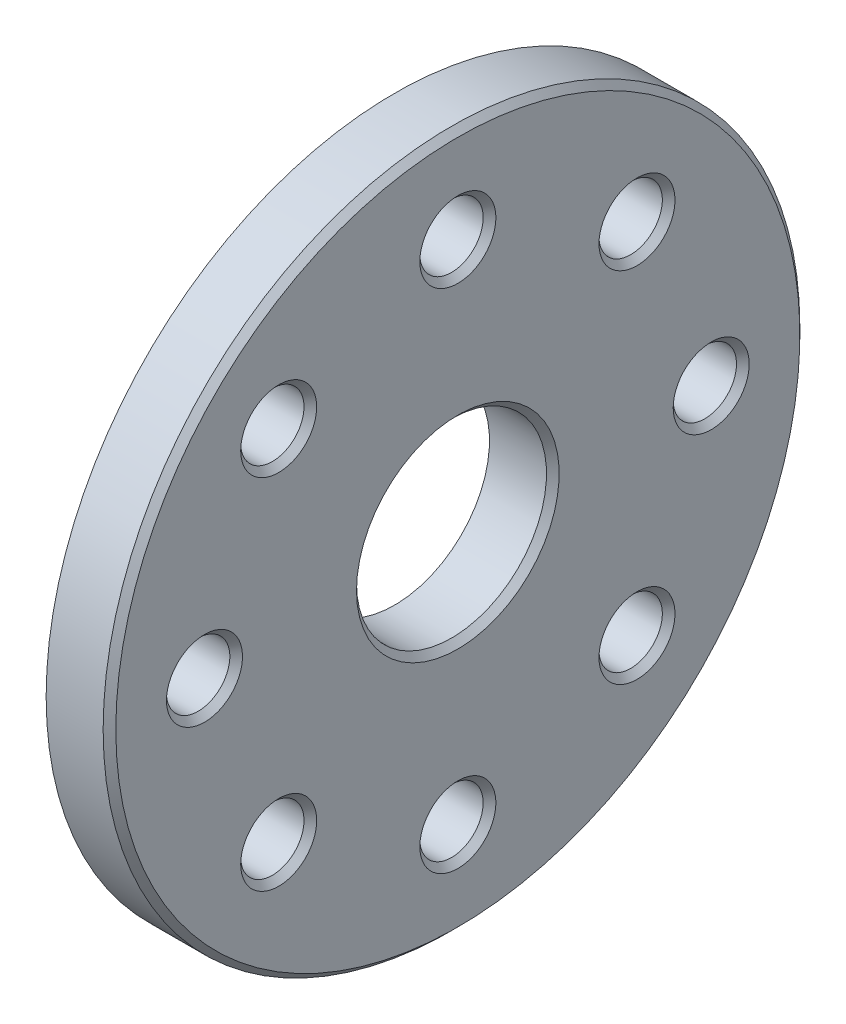
ISO-10303-21;
HEADER;
FILE_DESCRIPTION(('STEP AP214'),'2;1');
FILE_NAME('part.step','',(''),(''),'','','');
FILE_SCHEMA(('AUTOMOTIVE_DESIGN { 1 0 10303 214 1 1 1 1 }'));
ENDSEC;
DATA;
#1=APPLICATION_CONTEXT('core data for automotive mechanical design processes');
#2=APPLICATION_PROTOCOL_DEFINITION('international standard','automotive_design',2000,#1);
#3=PRODUCT_CONTEXT('',#1,'mechanical');
#4=PRODUCT('Part','Part','',(#3));
#5=PRODUCT_RELATED_PRODUCT_CATEGORY('part','',(#4));
#6=PRODUCT_DEFINITION_FORMATION('','',#4);
#7=PRODUCT_DEFINITION_CONTEXT('part definition',#1,'design');
#8=PRODUCT_DEFINITION('design','',#6,#7);
#9=PRODUCT_DEFINITION_SHAPE('','',#8);
#10=(LENGTH_UNIT() NAMED_UNIT(*) SI_UNIT(.MILLI.,.METRE.));
#11=(NAMED_UNIT(*) PLANE_ANGLE_UNIT() SI_UNIT($,.RADIAN.));
#12=(NAMED_UNIT(*) SI_UNIT($,.STERADIAN.) SOLID_ANGLE_UNIT());
#13=UNCERTAINTY_MEASURE_WITH_UNIT(LENGTH_MEASURE(1.E-05),#10,'distance_accuracy_value','');
#14=(GEOMETRIC_REPRESENTATION_CONTEXT(3) GLOBAL_UNCERTAINTY_ASSIGNED_CONTEXT((#13)) GLOBAL_UNIT_ASSIGNED_CONTEXT((#10,
#11,#12)) REPRESENTATION_CONTEXT('',''));
#15=CARTESIAN_POINT('',(0.,0.,0.));
#16=DIRECTION('',(0.,0.,1.));
#17=DIRECTION('',(1.,0.,0.));
#18=AXIS2_PLACEMENT_3D('',#15,#16,#17);
#19=CARTESIAN_POINT('',(0.,0.,0.));
#20=DIRECTION('',(-1.,0.,0.));
#21=DIRECTION('',(0.,0.,1.));
#22=AXIS2_PLACEMENT_3D('',#19,#20,#21);
#23=CYLINDRICAL_SURFACE('',#22,3.);
#24=CARTESIAN_POINT('',(0.799999999999997,0.,0.));
#25=DIRECTION('',(-1.,0.,0.));
#26=DIRECTION('',(0.,0.,1.));
#27=AXIS2_PLACEMENT_3D('',#24,#25,#26);
#28=CIRCLE('',#27,3.);
#29=CARTESIAN_POINT('',(0.799999999999997,0.,3.));
#30=VERTEX_POINT('',#29);
#31=EDGE_CURVE('E65',#30,#30,#28,.F.);
#32=ORIENTED_EDGE('',*,*,#31,.T.);
#33=EDGE_LOOP('',(#32));
#34=FACE_BOUND('',#33,.T.);
#35=CARTESIAN_POINT('',(-1.,0.,0.));
#36=DIRECTION('',(-1.,0.,0.));
#37=DIRECTION('',(0.,0.,1.));
#38=AXIS2_PLACEMENT_3D('',#35,#36,#37);
#39=CIRCLE('',#38,3.);
#40=CARTESIAN_POINT('',(-1.,0.,3.));
#41=VERTEX_POINT('',#40);
#42=EDGE_CURVE('E98',#41,#41,#39,.T.);
#43=ORIENTED_EDGE('',*,*,#42,.T.);
#44=EDGE_LOOP('',(#43));
#45=FACE_BOUND('',#44,.T.);
#46=ADVANCED_FACE('F30',(#34,#45),#23,.F.);
#47=CARTESIAN_POINT('',(-1.,3.,0.));
#48=DIRECTION('',(1.,0.,0.));
#49=DIRECTION('',(0.,0.,-1.));
#50=AXIS2_PLACEMENT_3D('',#47,#48,#49);
#51=PLANE('',#50);
#52=CARTESIAN_POINT('',(-1.,5.65685424949245,5.65685424949231));
#53=DIRECTION('',(-1.,0.,0.));
#54=DIRECTION('',(0.,-0.707106781186539,0.707106781186556));
#55=AXIS2_PLACEMENT_3D('',#52,#53,#54);
#56=CIRCLE('',#55,1.);
#57=CARTESIAN_POINT('',(-1.,4.94974746830591,6.36396103067887));
#58=VERTEX_POINT('',#57);
#59=EDGE_CURVE('E125',#58,#58,#56,.T.);
#60=ORIENTED_EDGE('',*,*,#59,.F.);
#61=EDGE_LOOP('',(#60));
#62=FACE_BOUND('',#61,.T.);
#63=CARTESIAN_POINT('',(-1.,0.,8.));
#64=DIRECTION('',(-1.,0.,0.));
#65=DIRECTION('',(0.,-1.,0.));
#66=AXIS2_PLACEMENT_3D('',#63,#64,#65);
#67=CIRCLE('',#66,1.);
#68=CARTESIAN_POINT('',(-1.,-0.999999999999917,8.00000000000001));
#69=VERTEX_POINT('',#68);
#70=EDGE_CURVE('E122',#69,#69,#67,.T.);
#71=ORIENTED_EDGE('',*,*,#70,.F.);
#72=EDGE_LOOP('',(#71));
#73=FACE_BOUND('',#72,.T.);
#74=CARTESIAN_POINT('',(-1.,-5.65685424949233,5.65685424949243));
#75=DIRECTION('',(-1.,0.,0.));
#76=DIRECTION('',(0.,-0.707106781186554,-0.707106781186541));
#77=AXIS2_PLACEMENT_3D('',#74,#75,#76);
#78=CIRCLE('',#77,1.);
#79=CARTESIAN_POINT('',(-1.,-6.36396103067888,4.94974746830589));
#80=VERTEX_POINT('',#79);
#81=EDGE_CURVE('E119',#80,#80,#78,.T.);
#82=ORIENTED_EDGE('',*,*,#81,.F.);
#83=EDGE_LOOP('',(#82));
#84=FACE_BOUND('',#83,.T.);
#85=CARTESIAN_POINT('',(-1.,-8.,0.));
#86=DIRECTION('',(-1.,0.,0.));
#87=DIRECTION('',(0.,0.,-1.));
#88=AXIS2_PLACEMENT_3D('',#85,#86,#87);
#89=CIRCLE('',#88,1.);
#90=CARTESIAN_POINT('',(-1.,-8.,-1.));
#91=VERTEX_POINT('',#90);
#92=EDGE_CURVE('E116',#91,#91,#89,.T.);
#93=ORIENTED_EDGE('',*,*,#92,.F.);
#94=EDGE_LOOP('',(#93));
#95=FACE_BOUND('',#94,.T.);
#96=CARTESIAN_POINT('',(-1.,-5.65685424949241,-5.65685424949235));
#97=DIRECTION('',(-1.,0.,0.));
#98=DIRECTION('',(0.,0.707106781186544,-0.707106781186551));
#99=AXIS2_PLACEMENT_3D('',#96,#97,#98);
#100=CIRCLE('',#99,1.);
#101=CARTESIAN_POINT('',(-1.,-4.94974746830587,-6.3639610306789));
#102=VERTEX_POINT('',#101);
#103=EDGE_CURVE('E113',#102,#102,#100,.T.);
#104=ORIENTED_EDGE('',*,*,#103,.F.);
#105=EDGE_LOOP('',(#104));
#106=FACE_BOUND('',#105,.T.);
#107=CARTESIAN_POINT('',(-1.,0.,-8.));
#108=DIRECTION('',(-1.,0.,0.));
#109=DIRECTION('',(0.,1.,0.));
#110=AXIS2_PLACEMENT_3D('',#107,#108,#109);
#111=CIRCLE('',#110,1.);
#112=CARTESIAN_POINT('',(-1.,0.999999999999972,-8.));
#113=VERTEX_POINT('',#112);
#114=EDGE_CURVE('E110',#113,#113,#111,.T.);
#115=ORIENTED_EDGE('',*,*,#114,.F.);
#116=EDGE_LOOP('',(#115));
#117=FACE_BOUND('',#116,.T.);
#118=CARTESIAN_POINT('',(-1.,5.65685424949237,-5.65685424949239));
#119=DIRECTION('',(-1.,0.,0.));
#120=DIRECTION('',(0.,0.707106781186549,0.707106781186546));
#121=AXIS2_PLACEMENT_3D('',#118,#119,#120);
#122=CIRCLE('',#121,1.);
#123=CARTESIAN_POINT('',(-1.,6.36396103067892,-4.94974746830584));
#124=VERTEX_POINT('',#123);
#125=EDGE_CURVE('E107',#124,#124,#122,.T.);
#126=ORIENTED_EDGE('',*,*,#125,.F.);
#127=EDGE_LOOP('',(#126));
#128=FACE_BOUND('',#127,.T.);
#129=CARTESIAN_POINT('',(-1.,8.,0.));
#130=DIRECTION('',(-1.,0.,0.));
#131=DIRECTION('',(0.,0.,1.));
#132=AXIS2_PLACEMENT_3D('',#129,#130,#131);
#133=CIRCLE('',#132,1.);
#134=CARTESIAN_POINT('',(-1.,8.,1.));
#135=VERTEX_POINT('',#134);
#136=EDGE_CURVE('E104',#135,#135,#133,.T.);
#137=ORIENTED_EDGE('',*,*,#136,.F.);
#138=EDGE_LOOP('',(#137));
#139=FACE_BOUND('',#138,.T.);
#140=ORIENTED_EDGE('',*,*,#42,.F.);
#141=EDGE_LOOP('',(#140));
#142=FACE_BOUND('',#141,.T.);
#143=CARTESIAN_POINT('',(-1.,0.,0.));
#144=DIRECTION('',(-1.,0.,0.));
#145=DIRECTION('',(0.,0.,1.));
#146=AXIS2_PLACEMENT_3D('',#143,#144,#145);
#147=CIRCLE('',#146,11.);
#148=CARTESIAN_POINT('',(-1.,0.,11.));
#149=VERTEX_POINT('',#148);
#150=EDGE_CURVE('E101',#149,#149,#147,.T.);
#151=ORIENTED_EDGE('',*,*,#150,.T.);
#152=EDGE_LOOP('',(#151));
#153=FACE_BOUND('',#152,.T.);
#154=ADVANCED_FACE('F131',(#62,#73,#84,#95,#106,#117,#128,#139,#142,#153),#51,.F.);
#155=CARTESIAN_POINT('',(0.,0.,0.));
#156=DIRECTION('',(-1.,0.,0.));
#157=DIRECTION('',(0.,0.,1.));
#158=AXIS2_PLACEMENT_3D('',#155,#156,#157);
#159=CYLINDRICAL_SURFACE('',#158,11.);
#160=CARTESIAN_POINT('',(0.799999999999998,0.,0.));
#161=DIRECTION('',(-1.,0.,0.));
#162=DIRECTION('',(0.,0.,1.));
#163=AXIS2_PLACEMENT_3D('',#160,#161,#162);
#164=CIRCLE('',#163,11.);
#165=CARTESIAN_POINT('',(0.799999999999998,0.,11.));
#166=VERTEX_POINT('',#165);
#167=EDGE_CURVE('E62',#166,#166,#164,.T.);
#168=ORIENTED_EDGE('',*,*,#167,.T.);
#169=EDGE_LOOP('',(#168));
#170=FACE_BOUND('',#169,.T.);
#171=ORIENTED_EDGE('',*,*,#150,.F.);
#172=EDGE_LOOP('',(#171));
#173=FACE_BOUND('',#172,.T.);
#174=ADVANCED_FACE('F134',(#170,#173),#159,.T.);
#175=CARTESIAN_POINT('',(1.,11.,0.));
#176=DIRECTION('',(-1.,0.,0.));
#177=DIRECTION('',(0.,0.,1.));
#178=AXIS2_PLACEMENT_3D('',#175,#176,#177);
#179=PLANE('',#178);
#180=CARTESIAN_POINT('',(1.,0.,0.));
#181=DIRECTION('',(-1.,0.,0.));
#182=DIRECTION('',(0.,0.,1.));
#183=AXIS2_PLACEMENT_3D('',#180,#181,#182);
#184=CIRCLE('',#183,3.2);
#185=CARTESIAN_POINT('',(1.,0.,3.2));
#186=VERTEX_POINT('',#185);
#187=EDGE_CURVE('E68',#186,#186,#184,.T.);
#188=ORIENTED_EDGE('',*,*,#187,.T.);
#189=EDGE_LOOP('',(#188));
#190=FACE_BOUND('',#189,.T.);
#191=CARTESIAN_POINT('',(1.,0.,0.));
#192=DIRECTION('',(-1.,0.,0.));
#193=DIRECTION('',(0.,0.,1.));
#194=AXIS2_PLACEMENT_3D('',#191,#192,#193);
#195=CIRCLE('',#194,10.8);
#196=CARTESIAN_POINT('',(1.,0.,10.8));
#197=VERTEX_POINT('',#196);
#198=EDGE_CURVE('E71',#197,#197,#195,.F.);
#199=ORIENTED_EDGE('',*,*,#198,.T.);
#200=EDGE_LOOP('',(#199));
#201=FACE_BOUND('',#200,.T.);
#202=CARTESIAN_POINT('',(1.,8.,0.));
#203=DIRECTION('',(-1.,0.,0.));
#204=DIRECTION('',(0.,0.,1.));
#205=AXIS2_PLACEMENT_3D('',#202,#203,#204);
#206=CIRCLE('',#205,1.2);
#207=CARTESIAN_POINT('',(1.,8.,1.2));
#208=VERTEX_POINT('',#207);
#209=EDGE_CURVE('E74',#208,#208,#206,.T.);
#210=ORIENTED_EDGE('',*,*,#209,.T.);
#211=EDGE_LOOP('',(#210));
#212=FACE_BOUND('',#211,.T.);
#213=CARTESIAN_POINT('',(1.,5.65685424949237,-5.65685424949239));
#214=DIRECTION('',(-1.,0.,0.));
#215=DIRECTION('',(0.,0.,1.));
#216=AXIS2_PLACEMENT_3D('',#213,#214,#215);
#217=CIRCLE('',#216,1.2);
#218=CARTESIAN_POINT('',(1.,5.65685424949237,-4.45685424949239));
#219=VERTEX_POINT('',#218);
#220=EDGE_CURVE('E77',#219,#219,#217,.T.);
#221=ORIENTED_EDGE('',*,*,#220,.T.);
#222=EDGE_LOOP('',(#221));
#223=FACE_BOUND('',#222,.T.);
#224=CARTESIAN_POINT('',(1.,0.,-8.));
#225=DIRECTION('',(-1.,0.,0.));
#226=DIRECTION('',(0.,0.,1.));
#227=AXIS2_PLACEMENT_3D('',#224,#225,#226);
#228=CIRCLE('',#227,1.2);
#229=CARTESIAN_POINT('',(1.,0.,-6.8));
#230=VERTEX_POINT('',#229);
#231=EDGE_CURVE('E80',#230,#230,#228,.T.);
#232=ORIENTED_EDGE('',*,*,#231,.T.);
#233=EDGE_LOOP('',(#232));
#234=FACE_BOUND('',#233,.T.);
#235=CARTESIAN_POINT('',(1.,-5.65685424949241,-5.65685424949235));
#236=DIRECTION('',(-1.,0.,0.));
#237=DIRECTION('',(0.,0.,1.));
#238=AXIS2_PLACEMENT_3D('',#235,#236,#237);
#239=CIRCLE('',#238,1.2);
#240=CARTESIAN_POINT('',(1.,-5.65685424949241,-4.45685424949235));
#241=VERTEX_POINT('',#240);
#242=EDGE_CURVE('E83',#241,#241,#239,.T.);
#243=ORIENTED_EDGE('',*,*,#242,.T.);
#244=EDGE_LOOP('',(#243));
#245=FACE_BOUND('',#244,.T.);
#246=CARTESIAN_POINT('',(1.,-8.,0.));
#247=DIRECTION('',(-1.,0.,0.));
#248=DIRECTION('',(0.,0.,1.));
#249=AXIS2_PLACEMENT_3D('',#246,#247,#248);
#250=CIRCLE('',#249,1.2);
#251=CARTESIAN_POINT('',(1.,-8.,1.2));
#252=VERTEX_POINT('',#251);
#253=EDGE_CURVE('E86',#252,#252,#250,.T.);
#254=ORIENTED_EDGE('',*,*,#253,.T.);
#255=EDGE_LOOP('',(#254));
#256=FACE_BOUND('',#255,.T.);
#257=CARTESIAN_POINT('',(1.,-5.65685424949233,5.65685424949243));
#258=DIRECTION('',(-1.,0.,0.));
#259=DIRECTION('',(0.,0.,1.));
#260=AXIS2_PLACEMENT_3D('',#257,#258,#259);
#261=CIRCLE('',#260,1.2);
#262=CARTESIAN_POINT('',(1.,-5.65685424949233,6.85685424949243));
#263=VERTEX_POINT('',#262);
#264=EDGE_CURVE('E89',#263,#263,#261,.T.);
#265=ORIENTED_EDGE('',*,*,#264,.T.);
#266=EDGE_LOOP('',(#265));
#267=FACE_BOUND('',#266,.T.);
#268=CARTESIAN_POINT('',(1.,0.,8.));
#269=DIRECTION('',(-1.,0.,0.));
#270=DIRECTION('',(0.,0.,1.));
#271=AXIS2_PLACEMENT_3D('',#268,#269,#270);
#272=CIRCLE('',#271,1.2);
#273=CARTESIAN_POINT('',(1.,0.,9.2));
#274=VERTEX_POINT('',#273);
#275=EDGE_CURVE('E92',#274,#274,#272,.T.);
#276=ORIENTED_EDGE('',*,*,#275,.T.);
#277=EDGE_LOOP('',(#276));
#278=FACE_BOUND('',#277,.T.);
#279=CARTESIAN_POINT('',(1.,5.65685424949245,5.65685424949231));
#280=DIRECTION('',(-1.,0.,0.));
#281=DIRECTION('',(0.,0.,1.));
#282=AXIS2_PLACEMENT_3D('',#279,#280,#281);
#283=CIRCLE('',#282,1.2);
#284=CARTESIAN_POINT('',(1.,5.65685424949245,6.85685424949232));
#285=VERTEX_POINT('',#284);
#286=EDGE_CURVE('E95',#285,#285,#283,.T.);
#287=ORIENTED_EDGE('',*,*,#286,.T.);
#288=EDGE_LOOP('',(#287));
#289=FACE_BOUND('',#288,.T.);
#290=ADVANCED_FACE('F155',(#190,#201,#212,#223,#234,#245,#256,#267,#278,#289),#179,.F.);
#291=CARTESIAN_POINT('',(1.,8.,0.));
#292=DIRECTION('',(-1.,0.,0.));
#293=DIRECTION('',(0.,0.,1.));
#294=AXIS2_PLACEMENT_3D('',#291,#292,#293);
#295=CYLINDRICAL_SURFACE('',#294,1.);
#296=CARTESIAN_POINT('',(0.799999999999997,8.,0.));
#297=DIRECTION('',(-1.,0.,0.));
#298=DIRECTION('',(0.,0.,1.));
#299=AXIS2_PLACEMENT_3D('',#296,#297,#298);
#300=CIRCLE('',#299,1.);
#301=CARTESIAN_POINT('',(0.799999999999997,8.,1.));
#302=VERTEX_POINT('',#301);
#303=EDGE_CURVE('E59',#302,#302,#300,.F.);
#304=ORIENTED_EDGE('',*,*,#303,.T.);
#305=EDGE_LOOP('',(#304));
#306=FACE_BOUND('',#305,.T.);
#307=ORIENTED_EDGE('',*,*,#136,.T.);
#308=EDGE_LOOP('',(#307));
#309=FACE_BOUND('',#308,.T.);
#310=ADVANCED_FACE('F161',(#306,#309),#295,.F.);
#311=CARTESIAN_POINT('',(1.,5.65685424949237,-5.65685424949239));
#312=DIRECTION('',(-1.,0.,0.));
#313=DIRECTION('',(0.,0.,1.));
#314=AXIS2_PLACEMENT_3D('',#311,#312,#313);
#315=CYLINDRICAL_SURFACE('',#314,1.);
#316=CARTESIAN_POINT('',(0.799999999999999,5.65685424949237,-5.65685424949239));
#317=DIRECTION('',(-1.,0.,0.));
#318=DIRECTION('',(0.,0.,1.));
#319=AXIS2_PLACEMENT_3D('',#316,#317,#318);
#320=CIRCLE('',#319,1.);
#321=CARTESIAN_POINT('',(0.799999999999999,5.65685424949237,-4.65685424949239));
#322=VERTEX_POINT('',#321);
#323=EDGE_CURVE('E56',#322,#322,#320,.F.);
#324=ORIENTED_EDGE('',*,*,#323,.T.);
#325=EDGE_LOOP('',(#324));
#326=FACE_BOUND('',#325,.T.);
#327=ORIENTED_EDGE('',*,*,#125,.T.);
#328=EDGE_LOOP('',(#327));
#329=FACE_BOUND('',#328,.T.);
#330=ADVANCED_FACE('F326',(#326,#329),#315,.F.);
#331=CARTESIAN_POINT('',(1.,0.,-8.));
#332=DIRECTION('',(-1.,0.,0.));
#333=DIRECTION('',(0.,0.,1.));
#334=AXIS2_PLACEMENT_3D('',#331,#332,#333);
#335=CYLINDRICAL_SURFACE('',#334,1.);
#336=CARTESIAN_POINT('',(0.799999999999997,0.,-8.));
#337=DIRECTION('',(-1.,0.,0.));
#338=DIRECTION('',(0.,0.,1.));
#339=AXIS2_PLACEMENT_3D('',#336,#337,#338);
#340=CIRCLE('',#339,1.);
#341=CARTESIAN_POINT('',(0.799999999999997,0.,-7.));
#342=VERTEX_POINT('',#341);
#343=EDGE_CURVE('E53',#342,#342,#340,.F.);
#344=ORIENTED_EDGE('',*,*,#343,.T.);
#345=EDGE_LOOP('',(#344));
#346=FACE_BOUND('',#345,.T.);
#347=ORIENTED_EDGE('',*,*,#114,.T.);
#348=EDGE_LOOP('',(#347));
#349=FACE_BOUND('',#348,.T.);
#350=ADVANCED_FACE('F316',(#346,#349),#335,.F.);
#351=CARTESIAN_POINT('',(1.,-5.65685424949241,-5.65685424949235));
#352=DIRECTION('',(-1.,0.,0.));
#353=DIRECTION('',(0.,0.,1.));
#354=AXIS2_PLACEMENT_3D('',#351,#352,#353);
#355=CYLINDRICAL_SURFACE('',#354,1.);
#356=CARTESIAN_POINT('',(0.799999999999996,-5.65685424949241,-5.65685424949235));
#357=DIRECTION('',(-1.,0.,0.));
#358=DIRECTION('',(0.,0.,1.));
#359=AXIS2_PLACEMENT_3D('',#356,#357,#358);
#360=CIRCLE('',#359,1.);
#361=CARTESIAN_POINT('',(0.799999999999996,-5.65685424949241,-4.65685424949235));
#362=VERTEX_POINT('',#361);
#363=EDGE_CURVE('E50',#362,#362,#360,.F.);
#364=ORIENTED_EDGE('',*,*,#363,.T.);
#365=EDGE_LOOP('',(#364));
#366=FACE_BOUND('',#365,.T.);
#367=ORIENTED_EDGE('',*,*,#103,.T.);
#368=EDGE_LOOP('',(#367));
#369=FACE_BOUND('',#368,.T.);
#370=ADVANCED_FACE('F306',(#366,#369),#355,.F.);
#371=CARTESIAN_POINT('',(1.,-8.,0.));
#372=DIRECTION('',(-1.,0.,0.));
#373=DIRECTION('',(0.,0.,1.));
#374=AXIS2_PLACEMENT_3D('',#371,#372,#373);
#375=CYLINDRICAL_SURFACE('',#374,1.);
#376=CARTESIAN_POINT('',(0.799999999999997,-8.,0.));
#377=DIRECTION('',(-1.,0.,0.));
#378=DIRECTION('',(0.,0.,1.));
#379=AXIS2_PLACEMENT_3D('',#376,#377,#378);
#380=CIRCLE('',#379,1.);
#381=CARTESIAN_POINT('',(0.799999999999997,-8.,1.));
#382=VERTEX_POINT('',#381);
#383=EDGE_CURVE('E45',#382,#382,#380,.F.);
#384=ORIENTED_EDGE('',*,*,#383,.T.);
#385=EDGE_LOOP('',(#384));
#386=FACE_BOUND('',#385,.T.);
#387=ORIENTED_EDGE('',*,*,#92,.T.);
#388=EDGE_LOOP('',(#387));
#389=FACE_BOUND('',#388,.T.);
#390=ADVANCED_FACE('F296',(#386,#389),#375,.F.);
#391=CARTESIAN_POINT('',(1.,-5.65685424949233,5.65685424949243));
#392=DIRECTION('',(-1.,0.,0.));
#393=DIRECTION('',(0.,0.,1.));
#394=AXIS2_PLACEMENT_3D('',#391,#392,#393);
#395=CYLINDRICAL_SURFACE('',#394,1.);
#396=CARTESIAN_POINT('',(0.799999999999999,-5.65685424949233,5.65685424949243));
#397=DIRECTION('',(-1.,0.,0.));
#398=DIRECTION('',(0.,0.,1.));
#399=AXIS2_PLACEMENT_3D('',#396,#397,#398);
#400=CIRCLE('',#399,1.);
#401=CARTESIAN_POINT('',(0.799999999999999,-5.65685424949233,6.65685424949243));
#402=VERTEX_POINT('',#401);
#403=EDGE_CURVE('E41',#402,#402,#400,.F.);
#404=ORIENTED_EDGE('',*,*,#403,.T.);
#405=EDGE_LOOP('',(#404));
#406=FACE_BOUND('',#405,.T.);
#407=ORIENTED_EDGE('',*,*,#81,.T.);
#408=EDGE_LOOP('',(#407));
#409=FACE_BOUND('',#408,.T.);
#410=ADVANCED_FACE('F287',(#406,#409),#395,.F.);
#411=CARTESIAN_POINT('',(1.,0.,8.));
#412=DIRECTION('',(-1.,0.,0.));
#413=DIRECTION('',(0.,0.,1.));
#414=AXIS2_PLACEMENT_3D('',#411,#412,#413);
#415=CYLINDRICAL_SURFACE('',#414,1.);
#416=CARTESIAN_POINT('',(0.799999999999997,0.,8.));
#417=DIRECTION('',(-1.,0.,0.));
#418=DIRECTION('',(0.,0.,1.));
#419=AXIS2_PLACEMENT_3D('',#416,#417,#418);
#420=CIRCLE('',#419,1.);
#421=CARTESIAN_POINT('',(0.799999999999997,0.,9.));
#422=VERTEX_POINT('',#421);
#423=EDGE_CURVE('E37',#422,#422,#420,.F.);
#424=ORIENTED_EDGE('',*,*,#423,.T.);
#425=EDGE_LOOP('',(#424));
#426=FACE_BOUND('',#425,.T.);
#427=ORIENTED_EDGE('',*,*,#70,.T.);
#428=EDGE_LOOP('',(#427));
#429=FACE_BOUND('',#428,.T.);
#430=ADVANCED_FACE('F278',(#426,#429),#415,.F.);
#431=CARTESIAN_POINT('',(1.,5.65685424949245,5.65685424949231));
#432=DIRECTION('',(-1.,0.,0.));
#433=DIRECTION('',(0.,0.,1.));
#434=AXIS2_PLACEMENT_3D('',#431,#432,#433);
#435=CYLINDRICAL_SURFACE('',#434,1.);
#436=CARTESIAN_POINT('',(0.799999999999996,5.65685424949245,5.65685424949231));
#437=DIRECTION('',(-1.,0.,0.));
#438=DIRECTION('',(0.,0.,1.));
#439=AXIS2_PLACEMENT_3D('',#436,#437,#438);
#440=CIRCLE('',#439,1.);
#441=CARTESIAN_POINT('',(0.799999999999996,5.65685424949245,6.65685424949231));
#442=VERTEX_POINT('',#441);
#443=EDGE_CURVE('E10',#442,#442,#440,.F.);
#444=ORIENTED_EDGE('',*,*,#443,.T.);
#445=EDGE_LOOP('',(#444));
#446=FACE_BOUND('',#445,.T.);
#447=ORIENTED_EDGE('',*,*,#59,.T.);
#448=EDGE_LOOP('',(#447));
#449=FACE_BOUND('',#448,.T.);
#450=ADVANCED_FACE('F129',(#446,#449),#435,.F.);
#451=CARTESIAN_POINT('',(1.,0.,0.));
#452=DIRECTION('',(1.,0.,0.));
#453=DIRECTION('',(0.,0.,-1.));
#454=AXIS2_PLACEMENT_3D('',#451,#452,#453);
#455=CONICAL_SURFACE('',#454,3.2,0.785398163397436);
#456=ORIENTED_EDGE('',*,*,#31,.F.);
#457=EDGE_LOOP('',(#456));
#458=FACE_BOUND('',#457,.T.);
#459=ORIENTED_EDGE('',*,*,#187,.F.);
#460=EDGE_LOOP('',(#459));
#461=FACE_BOUND('',#460,.T.);
#462=ADVANCED_FACE('F171',(#458,#461),#455,.F.);
#463=CARTESIAN_POINT('',(0.799999999999998,0.,0.));
#464=DIRECTION('',(-1.,0.,0.));
#465=DIRECTION('',(0.,0.,1.));
#466=AXIS2_PLACEMENT_3D('',#463,#464,#465);
#467=CONICAL_SURFACE('',#466,11.,0.785398163397448);
#468=ORIENTED_EDGE('',*,*,#198,.F.);
#469=EDGE_LOOP('',(#468));
#470=FACE_BOUND('',#469,.T.);
#471=ORIENTED_EDGE('',*,*,#167,.F.);
#472=EDGE_LOOP('',(#471));
#473=FACE_BOUND('',#472,.T.);
#474=ADVANCED_FACE('F174',(#470,#473),#467,.T.);
#475=CARTESIAN_POINT('',(1.,8.,0.));
#476=DIRECTION('',(1.,0.,0.));
#477=DIRECTION('',(0.,0.,-1.));
#478=AXIS2_PLACEMENT_3D('',#475,#476,#477);
#479=CONICAL_SURFACE('',#478,1.2,0.785398163397447);
#480=ORIENTED_EDGE('',*,*,#303,.F.);
#481=EDGE_LOOP('',(#480));
#482=FACE_BOUND('',#481,.T.);
#483=ORIENTED_EDGE('',*,*,#209,.F.);
#484=EDGE_LOOP('',(#483));
#485=FACE_BOUND('',#484,.T.);
#486=ADVANCED_FACE('F178',(#482,#485),#479,.F.);
#487=CARTESIAN_POINT('',(1.,5.65685424949237,-5.65685424949239));
#488=DIRECTION('',(1.,0.,0.));
#489=DIRECTION('',(0.,0.,-1.));
#490=AXIS2_PLACEMENT_3D('',#487,#488,#489);
#491=CONICAL_SURFACE('',#490,1.2,0.78539816339744);
#492=ORIENTED_EDGE('',*,*,#323,.F.);
#493=EDGE_LOOP('',(#492));
#494=FACE_BOUND('',#493,.T.);
#495=ORIENTED_EDGE('',*,*,#220,.F.);
#496=EDGE_LOOP('',(#495));
#497=FACE_BOUND('',#496,.T.);
#498=ADVANCED_FACE('F182',(#494,#497),#491,.F.);
#499=CARTESIAN_POINT('',(1.,0.,-8.));
#500=DIRECTION('',(1.,0.,0.));
#501=DIRECTION('',(0.,0.,-1.));
#502=AXIS2_PLACEMENT_3D('',#499,#500,#501);
#503=CONICAL_SURFACE('',#502,1.2,0.785398163397447);
#504=ORIENTED_EDGE('',*,*,#343,.F.);
#505=EDGE_LOOP('',(#504));
#506=FACE_BOUND('',#505,.T.);
#507=ORIENTED_EDGE('',*,*,#231,.F.);
#508=EDGE_LOOP('',(#507));
#509=FACE_BOUND('',#508,.T.);
#510=ADVANCED_FACE('F186',(#506,#509),#503,.F.);
#511=CARTESIAN_POINT('',(1.,-5.65685424949241,-5.65685424949235));
#512=DIRECTION('',(1.,0.,0.));
#513=DIRECTION('',(0.,0.,-1.));
#514=AXIS2_PLACEMENT_3D('',#511,#512,#513);
#515=CONICAL_SURFACE('',#514,1.2,0.78539816339745);
#516=ORIENTED_EDGE('',*,*,#363,.F.);
#517=EDGE_LOOP('',(#516));
#518=FACE_BOUND('',#517,.T.);
#519=ORIENTED_EDGE('',*,*,#242,.F.);
#520=EDGE_LOOP('',(#519));
#521=FACE_BOUND('',#520,.T.);
#522=ADVANCED_FACE('F190',(#518,#521),#515,.F.);
#523=CARTESIAN_POINT('',(1.,-8.,0.));
#524=DIRECTION('',(1.,0.,0.));
#525=DIRECTION('',(0.,0.,-1.));
#526=AXIS2_PLACEMENT_3D('',#523,#524,#525);
#527=CONICAL_SURFACE('',#526,1.2,0.785398163397447);
#528=ORIENTED_EDGE('',*,*,#383,.F.);
#529=EDGE_LOOP('',(#528));
#530=FACE_BOUND('',#529,.T.);
#531=ORIENTED_EDGE('',*,*,#253,.F.);
#532=EDGE_LOOP('',(#531));
#533=FACE_BOUND('',#532,.T.);
#534=ADVANCED_FACE('F194',(#530,#533),#527,.F.);
#535=CARTESIAN_POINT('',(1.,-5.65685424949233,5.65685424949243));
#536=DIRECTION('',(1.,0.,0.));
#537=DIRECTION('',(0.,0.,-1.));
#538=AXIS2_PLACEMENT_3D('',#535,#536,#537);
#539=CONICAL_SURFACE('',#538,1.2,0.785398163397449);
#540=ORIENTED_EDGE('',*,*,#403,.F.);
#541=EDGE_LOOP('',(#540));
#542=FACE_BOUND('',#541,.T.);
#543=ORIENTED_EDGE('',*,*,#264,.F.);
#544=EDGE_LOOP('',(#543));
#545=FACE_BOUND('',#544,.T.);
#546=ADVANCED_FACE('F198',(#542,#545),#539,.F.);
#547=CARTESIAN_POINT('',(1.,0.,8.));
#548=DIRECTION('',(1.,0.,0.));
#549=DIRECTION('',(0.,0.,-1.));
#550=AXIS2_PLACEMENT_3D('',#547,#548,#549);
#551=CONICAL_SURFACE('',#550,1.2,0.785398163397447);
#552=ORIENTED_EDGE('',*,*,#423,.F.);
#553=EDGE_LOOP('',(#552));
#554=FACE_BOUND('',#553,.T.);
#555=ORIENTED_EDGE('',*,*,#275,.F.);
#556=EDGE_LOOP('',(#555));
#557=FACE_BOUND('',#556,.T.);
#558=ADVANCED_FACE('F201',(#554,#557),#551,.F.);
#559=CARTESIAN_POINT('',(1.,5.65685424949245,5.65685424949231));
#560=DIRECTION('',(1.,0.,0.));
#561=DIRECTION('',(0.,0.,-1.));
#562=AXIS2_PLACEMENT_3D('',#559,#560,#561);
#563=CONICAL_SURFACE('',#562,1.2,0.785398163397444);
#564=ORIENTED_EDGE('',*,*,#443,.F.);
#565=EDGE_LOOP('',(#564));
#566=FACE_BOUND('',#565,.T.);
#567=ORIENTED_EDGE('',*,*,#286,.F.);
#568=EDGE_LOOP('',(#567));
#569=FACE_BOUND('',#568,.T.);
#570=ADVANCED_FACE('F32',(#566,#569),#563,.F.);
#571=CLOSED_SHELL('',(#46,#154,#174,#290,#310,#330,#350,#370,#390,#410,#430,#450,#462,#474,#486,
#498,#510,#522,#534,#546,#558,#570));
#572=MANIFOLD_SOLID_BREP('B2',#571);
#573=ADVANCED_BREP_SHAPE_REPRESENTATION('',(#18,#572),#14);
#574=SHAPE_DEFINITION_REPRESENTATION(#9,#573);
ENDSEC;
END-ISO-10303-21;
